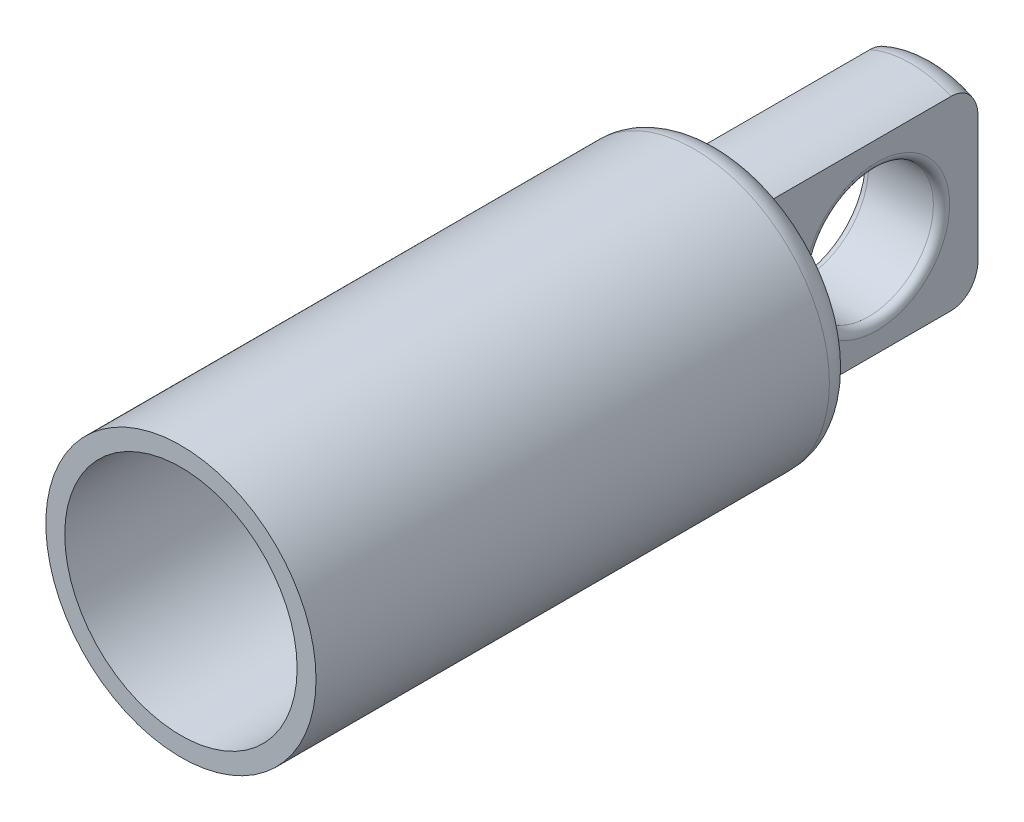
ISO-10303-21;
HEADER;
FILE_DESCRIPTION(('STEP AP214'),'2;1');
FILE_NAME('part.step','',(''),(''),'','','');
FILE_SCHEMA(('AUTOMOTIVE_DESIGN { 1 0 10303 214 1 1 1 1 }'));
ENDSEC;
DATA;
#1=APPLICATION_CONTEXT('core data for automotive mechanical design processes');
#2=APPLICATION_PROTOCOL_DEFINITION('international standard','automotive_design',2000,#1);
#3=PRODUCT_CONTEXT('',#1,'mechanical');
#4=PRODUCT('Part','Part','',(#3));
#5=PRODUCT_RELATED_PRODUCT_CATEGORY('part','',(#4));
#6=PRODUCT_DEFINITION_FORMATION('','',#4);
#7=PRODUCT_DEFINITION_CONTEXT('part definition',#1,'design');
#8=PRODUCT_DEFINITION('design','',#6,#7);
#9=PRODUCT_DEFINITION_SHAPE('','',#8);
#10=(LENGTH_UNIT() NAMED_UNIT(*) SI_UNIT(.MILLI.,.METRE.));
#11=(NAMED_UNIT(*) PLANE_ANGLE_UNIT() SI_UNIT($,.RADIAN.));
#12=(NAMED_UNIT(*) SI_UNIT($,.STERADIAN.) SOLID_ANGLE_UNIT());
#13=UNCERTAINTY_MEASURE_WITH_UNIT(LENGTH_MEASURE(1.E-05),#10,'distance_accuracy_value','');
#14=(GEOMETRIC_REPRESENTATION_CONTEXT(3) GLOBAL_UNCERTAINTY_ASSIGNED_CONTEXT((#13)) GLOBAL_UNIT_ASSIGNED_CONTEXT((#10,
#11,#12)) REPRESENTATION_CONTEXT('',''));
#15=CARTESIAN_POINT('',(0.,0.,0.));
#16=DIRECTION('',(0.,0.,1.));
#17=DIRECTION('',(1.,0.,0.));
#18=AXIS2_PLACEMENT_3D('',#15,#16,#17);
#19=CARTESIAN_POINT('',(0.,0.,-10.16));
#20=DIRECTION('',(0.,0.,1.));
#21=DIRECTION('',(1.,0.,0.));
#22=AXIS2_PLACEMENT_3D('',#19,#20,#21);
#23=CYLINDRICAL_SURFACE('',#22,4.7625);
#24=DIRECTION('',(0.,0.,-1.));
#25=VECTOR('',#24,1.);
#26=CARTESIAN_POINT('',(-1.905,-4.36490334944544,9.18557734984579));
#27=LINE('',#26,#25);
#28=CARTESIAN_POINT('',(-1.905,-4.36490334944544,0.));
#29=VERTEX_POINT('',#28);
#30=CARTESIAN_POINT('',(-1.905,-4.36490334944544,-8.89));
#31=VERTEX_POINT('',#30);
#32=EDGE_CURVE('E244',#29,#31,#27,.T.);
#33=ORIENTED_EDGE('',*,*,#32,.T.);
#34=CARTESIAN_POINT('',(0.,0.,-8.89));
#35=DIRECTION('',(0.,0.,-1.));
#36=DIRECTION('',(-1.,0.,0.));
#37=AXIS2_PLACEMENT_3D('',#34,#35,#36);
#38=CIRCLE('',#37,4.7625);
#39=CARTESIAN_POINT('',(1.905,-4.36490334944544,-8.89));
#40=VERTEX_POINT('',#39);
#41=EDGE_CURVE('E77',#31,#40,#38,.F.);
#42=ORIENTED_EDGE('',*,*,#41,.T.);
#43=DIRECTION('',(0.,0.,-1.));
#44=VECTOR('',#43,1.);
#45=CARTESIAN_POINT('',(1.905,-4.36490334944544,9.18557734984579));
#46=LINE('',#45,#44);
#47=CARTESIAN_POINT('',(1.905,-4.36490334944544,0.));
#48=VERTEX_POINT('',#47);
#49=EDGE_CURVE('E113',#48,#40,#46,.T.);
#50=ORIENTED_EDGE('',*,*,#49,.F.);
#51=CARTESIAN_POINT('',(0.,0.,0.));
#52=DIRECTION('',(0.,0.,1.));
#53=DIRECTION('',(1.,0.,0.));
#54=AXIS2_PLACEMENT_3D('',#51,#52,#53);
#55=CIRCLE('',#54,4.7625);
#56=EDGE_CURVE('E123',#48,#29,#55,.F.);
#57=ORIENTED_EDGE('',*,*,#56,.T.);
#58=EDGE_LOOP('',(#33,#42,#50,#57));
#59=FACE_BOUND('',#58,.T.);
#60=ADVANCED_FACE('F52',(#59),#23,.T.);
#61=CARTESIAN_POINT('',(0.,0.,25.4));
#62=DIRECTION('',(0.,0.,-1.));
#63=DIRECTION('',(-1.,0.,0.));
#64=AXIS2_PLACEMENT_3D('',#61,#62,#63);
#65=CYLINDRICAL_SURFACE('',#64,6.35);
#66=CARTESIAN_POINT('',(0.,0.,1.27));
#67=DIRECTION('',(0.,0.,1.));
#68=DIRECTION('',(1.,0.,0.));
#69=AXIS2_PLACEMENT_3D('',#66,#67,#68);
#70=CIRCLE('',#69,6.35);
#71=CARTESIAN_POINT('',(6.35,0.,1.27));
#72=VERTEX_POINT('',#71);
#73=EDGE_CURVE('E138',#72,#72,#70,.T.);
#74=ORIENTED_EDGE('',*,*,#73,.T.);
#75=EDGE_LOOP('',(#74));
#76=FACE_BOUND('',#75,.T.);
#77=CARTESIAN_POINT('',(0.,0.,25.4));
#78=DIRECTION('',(0.,0.,1.));
#79=DIRECTION('',(1.,0.,0.));
#80=AXIS2_PLACEMENT_3D('',#77,#78,#79);
#81=CIRCLE('',#80,6.35);
#82=CARTESIAN_POINT('',(6.35,0.,25.4));
#83=VERTEX_POINT('',#82);
#84=EDGE_CURVE('E273',#83,#83,#81,.T.);
#85=ORIENTED_EDGE('',*,*,#84,.F.);
#86=EDGE_LOOP('',(#85));
#87=FACE_BOUND('',#86,.T.);
#88=ADVANCED_FACE('F206',(#76,#87),#65,.T.);
#89=CARTESIAN_POINT('',(0.,0.,25.4));
#90=DIRECTION('',(0.,0.,1.));
#91=DIRECTION('',(1.,0.,0.));
#92=AXIS2_PLACEMENT_3D('',#89,#90,#91);
#93=PLANE('',#92);
#94=CARTESIAN_POINT('',(0.,0.,25.4));
#95=DIRECTION('',(0.,0.,1.));
#96=DIRECTION('',(1.,0.,0.));
#97=AXIS2_PLACEMENT_3D('',#94,#95,#96);
#98=CIRCLE('',#97,5.461);
#99=CARTESIAN_POINT('',(5.461,0.,25.4));
#100=VERTEX_POINT('',#99);
#101=EDGE_CURVE('E269',#100,#100,#98,.T.);
#102=ORIENTED_EDGE('',*,*,#101,.F.);
#103=EDGE_LOOP('',(#102));
#104=FACE_BOUND('',#103,.T.);
#105=ORIENTED_EDGE('',*,*,#84,.T.);
#106=EDGE_LOOP('',(#105));
#107=FACE_BOUND('',#106,.T.);
#108=ADVANCED_FACE('F203',(#104,#107),#93,.T.);
#109=CARTESIAN_POINT('',(0.,0.,0.));
#110=DIRECTION('',(0.,0.,1.));
#111=DIRECTION('',(1.,0.,0.));
#112=AXIS2_PLACEMENT_3D('',#109,#110,#111);
#113=PLANE('',#112);
#114=ORIENTED_EDGE('',*,*,#56,.F.);
#115=DIRECTION('',(0.,1.,0.));
#116=VECTOR('',#115,1.);
#117=CARTESIAN_POINT('',(1.905,4.36490334944544,0.));
#118=LINE('',#117,#116);
#119=CARTESIAN_POINT('',(1.905,4.36490334944544,0.));
#120=VERTEX_POINT('',#119);
#121=EDGE_CURVE('E108',#48,#120,#118,.T.);
#122=ORIENTED_EDGE('',*,*,#121,.T.);
#123=CARTESIAN_POINT('',(-1.905,4.36490334944544,0.));
#124=VERTEX_POINT('',#123);
#125=EDGE_CURVE('E121',#124,#120,#55,.F.);
#126=ORIENTED_EDGE('',*,*,#125,.F.);
#127=DIRECTION('',(0.,-1.,0.));
#128=VECTOR('',#127,1.);
#129=CARTESIAN_POINT('',(-1.905,4.36490334944544,0.));
#130=LINE('',#129,#128);
#131=EDGE_CURVE('E249',#124,#29,#130,.T.);
#132=ORIENTED_EDGE('',*,*,#131,.T.);
#133=EDGE_LOOP('',(#114,#122,#126,#132));
#134=FACE_BOUND('',#133,.T.);
#135=CARTESIAN_POINT('',(0.,0.,0.));
#136=DIRECTION('',(0.,0.,1.));
#137=DIRECTION('',(1.,0.,0.));
#138=AXIS2_PLACEMENT_3D('',#135,#136,#137);
#139=CIRCLE('',#138,5.08);
#140=CARTESIAN_POINT('',(5.08,0.,0.));
#141=VERTEX_POINT('',#140);
#142=EDGE_CURVE('E132',#141,#141,#139,.F.);
#143=ORIENTED_EDGE('',*,*,#142,.T.);
#144=EDGE_LOOP('',(#143));
#145=FACE_BOUND('',#144,.T.);
#146=ADVANCED_FACE('F118',(#134,#145),#113,.F.);
#147=CARTESIAN_POINT('',(0.,0.,25.4));
#148=DIRECTION('',(0.,0.,-1.));
#149=DIRECTION('',(-1.,0.,0.));
#150=AXIS2_PLACEMENT_3D('',#147,#148,#149);
#151=CYLINDRICAL_SURFACE('',#150,5.461);
#152=ORIENTED_EDGE('',*,*,#101,.T.);
#153=EDGE_LOOP('',(#152));
#154=FACE_BOUND('',#153,.T.);
#155=CARTESIAN_POINT('',(0.,0.,0.889000000000001));
#156=DIRECTION('',(0.,0.,1.));
#157=DIRECTION('',(1.,0.,0.));
#158=AXIS2_PLACEMENT_3D('',#155,#156,#157);
#159=CIRCLE('',#158,5.461);
#160=CARTESIAN_POINT('',(5.461,0.,0.889000000000001));
#161=VERTEX_POINT('',#160);
#162=EDGE_CURVE('E261',#161,#161,#159,.T.);
#163=ORIENTED_EDGE('',*,*,#162,.F.);
#164=EDGE_LOOP('',(#163));
#165=FACE_BOUND('',#164,.T.);
#166=ADVANCED_FACE('F195',(#154,#165),#151,.F.);
#167=CARTESIAN_POINT('',(0.,0.,0.889));
#168=DIRECTION('',(0.,0.,1.));
#169=DIRECTION('',(1.,0.,0.));
#170=AXIS2_PLACEMENT_3D('',#167,#168,#169);
#171=PLANE('',#170);
#172=ORIENTED_EDGE('',*,*,#162,.T.);
#173=EDGE_LOOP('',(#172));
#174=FACE_BOUND('',#173,.T.);
#175=ADVANCED_FACE('F198',(#174),#171,.T.);
#176=CARTESIAN_POINT('',(0.,0.,1.27));
#177=DIRECTION('',(0.,0.,1.));
#178=DIRECTION('',(1.,0.,0.));
#179=AXIS2_PLACEMENT_3D('',#176,#177,#178);
#180=TOROIDAL_SURFACE('',#179,5.08,1.27);
#181=ORIENTED_EDGE('',*,*,#142,.F.);
#182=EDGE_LOOP('',(#181));
#183=FACE_BOUND('',#182,.T.);
#184=ORIENTED_EDGE('',*,*,#73,.F.);
#185=EDGE_LOOP('',(#184));
#186=FACE_BOUND('',#185,.T.);
#187=ADVANCED_FACE('F194',(#183,#186),#180,.T.);
#188=DIRECTION('',(0.,0.,-1.));
#189=VECTOR('',#188,1.);
#190=CARTESIAN_POINT('',(1.905,4.36490334944544,9.18557734984579));
#191=LINE('',#190,#189);
#192=CARTESIAN_POINT('',(1.905,4.36490334944544,-8.89));
#193=VERTEX_POINT('',#192);
#194=EDGE_CURVE('E105',#120,#193,#191,.T.);
#195=ORIENTED_EDGE('',*,*,#194,.T.);
#196=CARTESIAN_POINT('',(0.,0.,-8.89));
#197=DIRECTION('',(0.,0.,-1.));
#198=DIRECTION('',(-1.,0.,0.));
#199=AXIS2_PLACEMENT_3D('',#196,#197,#198);
#200=CIRCLE('',#199,4.7625);
#201=CARTESIAN_POINT('',(-1.905,4.36490334944544,-8.89));
#202=VERTEX_POINT('',#201);
#203=EDGE_CURVE('E11',#193,#202,#200,.F.);
#204=ORIENTED_EDGE('',*,*,#203,.T.);
#205=DIRECTION('',(0.,0.,-1.));
#206=VECTOR('',#205,1.);
#207=CARTESIAN_POINT('',(-1.905,4.36490334944544,9.18557734984579));
#208=LINE('',#207,#206);
#209=EDGE_CURVE('E130',#124,#202,#208,.T.);
#210=ORIENTED_EDGE('',*,*,#209,.F.);
#211=ORIENTED_EDGE('',*,*,#125,.T.);
#212=EDGE_LOOP('',(#195,#204,#210,#211));
#213=FACE_BOUND('',#212,.T.);
#214=ADVANCED_FACE('F128',(#213),#23,.T.);
#215=CARTESIAN_POINT('',(0.,0.,-10.16));
#216=DIRECTION('',(0.,0.,-1.));
#217=DIRECTION('',(-1.,0.,0.));
#218=AXIS2_PLACEMENT_3D('',#215,#216,#217);
#219=PLANE('',#218);
#220=DIRECTION('',(0.,1.,0.));
#221=VECTOR('',#220,1.);
#222=CARTESIAN_POINT('',(1.905,4.36490334944544,-10.16));
#223=LINE('',#222,#221);
#224=CARTESIAN_POINT('',(1.905,-2.92720536519049,-10.16));
#225=VERTEX_POINT('',#224);
#226=CARTESIAN_POINT('',(1.905,2.92720536519049,-10.16));
#227=VERTEX_POINT('',#226);
#228=EDGE_CURVE('E125',#225,#227,#223,.T.);
#229=ORIENTED_EDGE('',*,*,#228,.F.);
#230=CARTESIAN_POINT('',(0.,0.,-10.16));
#231=DIRECTION('',(0.,0.,-1.));
#232=DIRECTION('',(-1.,0.,0.));
#233=AXIS2_PLACEMENT_3D('',#230,#231,#232);
#234=CIRCLE('',#233,3.4925);
#235=CARTESIAN_POINT('',(-1.905,-2.92720536519049,-10.16));
#236=VERTEX_POINT('',#235);
#237=EDGE_CURVE('E161',#225,#236,#234,.T.);
#238=ORIENTED_EDGE('',*,*,#237,.T.);
#239=DIRECTION('',(0.,-1.,0.));
#240=VECTOR('',#239,1.);
#241=CARTESIAN_POINT('',(-1.905,4.36490334944544,-10.16));
#242=LINE('',#241,#240);
#243=CARTESIAN_POINT('',(-1.905,2.92720536519049,-10.16));
#244=VERTEX_POINT('',#243);
#245=EDGE_CURVE('E246',#244,#236,#242,.T.);
#246=ORIENTED_EDGE('',*,*,#245,.F.);
#247=CARTESIAN_POINT('',(0.,0.,-10.16));
#248=DIRECTION('',(0.,0.,-1.));
#249=DIRECTION('',(-1.,0.,0.));
#250=AXIS2_PLACEMENT_3D('',#247,#248,#249);
#251=CIRCLE('',#250,3.4925);
#252=EDGE_CURVE('E157',#244,#227,#251,.T.);
#253=ORIENTED_EDGE('',*,*,#252,.T.);
#254=EDGE_LOOP('',(#229,#238,#246,#253));
#255=FACE_BOUND('',#254,.T.);
#256=ADVANCED_FACE('F184',(#255),#219,.T.);
#257=CARTESIAN_POINT('',(-1.905,4.36490334944544,9.18557734984579));
#258=DIRECTION('',(1.,0.,0.));
#259=DIRECTION('',(0.,0.,-1.));
#260=AXIS2_PLACEMENT_3D('',#257,#258,#259);
#261=PLANE('',#260);
#262=CARTESIAN_POINT('',(-1.905,0.,-5.3975));
#263=DIRECTION('',(1.,0.,0.));
#264=DIRECTION('',(0.,0.,-1.));
#265=AXIS2_PLACEMENT_3D('',#262,#263,#264);
#266=CIRCLE('',#265,3.429);
#267=CARTESIAN_POINT('',(-1.905,0.,-8.8265));
#268=VERTEX_POINT('',#267);
#269=EDGE_CURVE('E136',#268,#268,#266,.T.);
#270=ORIENTED_EDGE('',*,*,#269,.T.);
#271=EDGE_LOOP('',(#270));
#272=FACE_BOUND('',#271,.T.);
#273=ORIENTED_EDGE('',*,*,#245,.T.);
#274=CARTESIAN_POINT('',(-1.905,-2.92720536519049,-10.16));
#275=CARTESIAN_POINT('',(-1.905,-2.98132402105541,-10.1600064832095));
#276=CARTESIAN_POINT('',(-1.905,-3.03546640915894,-10.1575694277126));
#277=CARTESIAN_POINT('',(-1.905,-3.14337038378051,-10.147600787364));
#278=CARTESIAN_POINT('',(-1.905,-3.19713115345611,-10.1400604319878));
#279=CARTESIAN_POINT('',(-1.905,-3.30381074626772,-10.1196462465851));
#280=CARTESIAN_POINT('',(-1.905,-3.35672661587625,-10.1067567396132));
#281=CARTESIAN_POINT('',(-1.905,-3.46087340765745,-10.0755358837916));
#282=CARTESIAN_POINT('',(-1.905,-3.51210576523154,-10.0572093118652));
#283=CARTESIAN_POINT('',(-1.905,-3.63377839124686,-10.0059866506064));
#284=CARTESIAN_POINT('',(-1.905,-3.70303952694985,-9.97021263677757));
#285=CARTESIAN_POINT('',(-1.905,-3.83451020752514,-9.88771868456725));
#286=CARTESIAN_POINT('',(-1.905,-3.89673567753279,-9.84102423131769));
#287=CARTESIAN_POINT('',(-1.905,-4.01235640306473,-9.73713293052762));
#288=CARTESIAN_POINT('',(-1.905,-4.06570386564284,-9.67988252894815));
#289=CARTESIAN_POINT('',(-1.905,-4.16092021285018,-9.55641047586642));
#290=CARTESIAN_POINT('',(-1.905,-4.20278291350322,-9.49018401976242));
#291=CARTESIAN_POINT('',(-1.905,-4.26985685386264,-9.35715368823077));
#292=CARTESIAN_POINT('',(-1.905,-4.29622038509427,-9.29092834996992));
#293=CARTESIAN_POINT('',(-1.905,-4.33658892991174,-9.15489125363754));
#294=CARTESIAN_POINT('',(-1.905,-4.35062151379467,-9.0850878676247));
#295=CARTESIAN_POINT('',(-1.905,-4.36043965484168,-8.99397786798046));
#296=CARTESIAN_POINT('',(-1.905,-4.36211401183235,-8.9732011982541));
#297=CARTESIAN_POINT('',(-1.905,-4.36434422473604,-8.93161949765128));
#298=CARTESIAN_POINT('',(-1.905,-4.36490177407431,-8.91081455765388));
#299=CARTESIAN_POINT('',(-1.905,-4.36490334944546,-8.89));
#300=B_SPLINE_CURVE_WITH_KNOTS('',3,(#274,#275,#276,#277,#278,#279,#280,#281,#282,#283,#284,
#285,#286,#287,#288,#289,#290,#291,#292,#293,#294,#295,#296,#297,#298,#299),.UNSPECIFIED.,.F.,
.F.,(4,2,2,2,2,2,2,2,2,2,2,2,4),(0.,0.162335826820369,0.324951354612323,0.488046869242432,
0.650999512834123,0.883796058421268,1.11605465223082,1.34952572611191,1.58312226697818,
1.79588027556207,2.00816136727746,2.07067322340408,2.13309022028259),.UNSPECIFIED.);
#301=EDGE_CURVE('E173',#236,#31,#300,.T.);
#302=ORIENTED_EDGE('',*,*,#301,.T.);
#303=ORIENTED_EDGE('',*,*,#32,.F.);
#304=ORIENTED_EDGE('',*,*,#131,.F.);
#305=ORIENTED_EDGE('',*,*,#209,.T.);
#306=CARTESIAN_POINT('',(-1.905,4.36490334944544,-8.89));
#307=CARTESIAN_POINT('',(-1.905,4.36490422359483,-8.92339919910838));
#308=CARTESIAN_POINT('',(-1.905,4.36346480508041,-8.95678177763766));
#309=CARTESIAN_POINT('',(-1.905,4.35772999076058,-9.02329490045136));
#310=CARTESIAN_POINT('',(-1.905,4.35343509534946,-9.05642548786607));
#311=CARTESIAN_POINT('',(-1.905,4.33634337546593,-9.15489806950019));
#312=CARTESIAN_POINT('',(-1.905,4.31933911241619,-9.21955802636618));
#313=CARTESIAN_POINT('',(-1.905,4.27475667885088,-9.34506168882081));
#314=CARTESIAN_POINT('',(-1.905,4.24717995463365,-9.40590591507211));
#315=CARTESIAN_POINT('',(-1.905,4.1824556513036,-9.52228788782987));
#316=CARTESIAN_POINT('',(-1.905,4.14530451663395,-9.57782365245797));
#317=CARTESIAN_POINT('',(-1.905,4.06158354676759,-9.6837275420454));
#318=CARTESIAN_POINT('',(-1.905,4.01478585752914,-9.73391495783361));
#319=CARTESIAN_POINT('',(-1.905,3.91397899782167,-9.8263799471498));
#320=CARTESIAN_POINT('',(-1.905,3.85996996730528,-9.8686576741452));
#321=CARTESIAN_POINT('',(-1.905,3.74194657661533,-9.94764916451322));
#322=CARTESIAN_POINT('',(-1.905,3.6774828837546,-9.98368986955687));
#323=CARTESIAN_POINT('',(-1.905,3.54380992591659,-10.0457069429606));
#324=CARTESIAN_POINT('',(-1.905,3.47459377568293,-10.0716683304353));
#325=CARTESIAN_POINT('',(-1.905,3.32657767116101,-10.1155078617819));
#326=CARTESIAN_POINT('',(-1.905,3.2474882057244,-10.1323976470139));
#327=CARTESIAN_POINT('',(-1.905,3.08795205769954,-10.1546476910731));
#328=CARTESIAN_POINT('',(-1.905,3.0075107274282,-10.1600458876112));
#329=CARTESIAN_POINT('',(-1.905,2.92720536519049,-10.16));
#330=B_SPLINE_CURVE_WITH_KNOTS('',3,(#306,#307,#308,#309,#310,#311,#312,#313,#314,#315,#316,
#317,#318,#319,#320,#321,#322,#323,#324,#325,#326,#327,#328,#329),.UNSPECIFIED.,.F.,.F.,(4,2,2,
2,2,2,2,2,2,2,2,4),(0.,0.100133888262806,0.200250233668484,0.399780863197951,0.599284206941912,
0.798861745352971,1.00384490895569,1.20882409496814,1.42948410837142,1.65047084446328,
1.89221565367468,2.13316113395296),.UNSPECIFIED.);
#331=EDGE_CURVE('E165',#202,#244,#330,.T.);
#332=ORIENTED_EDGE('',*,*,#331,.T.);
#333=EDGE_LOOP('',(#273,#302,#303,#304,#305,#332));
#334=FACE_BOUND('',#333,.T.);
#335=ADVANCED_FACE('F179',(#272,#334),#261,.F.);
#336=CARTESIAN_POINT('',(1.905,4.36490334944544,9.18557734984579));
#337=DIRECTION('',(-1.,0.,0.));
#338=DIRECTION('',(0.,0.,1.));
#339=AXIS2_PLACEMENT_3D('',#336,#337,#338);
#340=PLANE('',#339);
#341=CARTESIAN_POINT('',(1.905,0.,-5.3975));
#342=DIRECTION('',(-1.,0.,0.));
#343=DIRECTION('',(0.,0.,1.));
#344=AXIS2_PLACEMENT_3D('',#341,#342,#343);
#345=CIRCLE('',#344,3.429);
#346=CARTESIAN_POINT('',(1.905,0.,-1.9685));
#347=VERTEX_POINT('',#346);
#348=EDGE_CURVE('E153',#347,#347,#345,.T.);
#349=ORIENTED_EDGE('',*,*,#348,.T.);
#350=EDGE_LOOP('',(#349));
#351=FACE_BOUND('',#350,.T.);
#352=ORIENTED_EDGE('',*,*,#49,.T.);
#353=CARTESIAN_POINT('',(1.905,-4.36490334944544,-8.89));
#354=CARTESIAN_POINT('',(1.905,-4.36490422359483,-8.92339919910838));
#355=CARTESIAN_POINT('',(1.905,-4.36346480508041,-8.95678177763765));
#356=CARTESIAN_POINT('',(1.905,-4.35772999076058,-9.02329490045136));
#357=CARTESIAN_POINT('',(1.905,-4.35343509534946,-9.05642548786607));
#358=CARTESIAN_POINT('',(1.905,-4.33634337546593,-9.15489806950019));
#359=CARTESIAN_POINT('',(1.905,-4.31933911241619,-9.21955802636618));
#360=CARTESIAN_POINT('',(1.905,-4.27475667885088,-9.34506168882081));
#361=CARTESIAN_POINT('',(1.905,-4.24717995463365,-9.40590591507211));
#362=CARTESIAN_POINT('',(1.905,-4.1824556513036,-9.52228788782987));
#363=CARTESIAN_POINT('',(1.905,-4.14530451663396,-9.57782365245797));
#364=CARTESIAN_POINT('',(1.905,-4.06158354676759,-9.6837275420454));
#365=CARTESIAN_POINT('',(1.905,-4.01478585752914,-9.73391495783361));
#366=CARTESIAN_POINT('',(1.905,-3.91397899782168,-9.8263799471498));
#367=CARTESIAN_POINT('',(1.905,-3.85996996730528,-9.8686576741452));
#368=CARTESIAN_POINT('',(1.905,-3.74194657661533,-9.94764916451322));
#369=CARTESIAN_POINT('',(1.905,-3.6774828837546,-9.98368986955687));
#370=CARTESIAN_POINT('',(1.905,-3.54380992591659,-10.0457069429606));
#371=CARTESIAN_POINT('',(1.905,-3.47459377568293,-10.0716683304353));
#372=CARTESIAN_POINT('',(1.905,-3.32657767116101,-10.1155078617819));
#373=CARTESIAN_POINT('',(1.905,-3.2474882057244,-10.1323976470139));
#374=CARTESIAN_POINT('',(1.905,-3.08795205769954,-10.1546476910731));
#375=CARTESIAN_POINT('',(1.905,-3.0075107274282,-10.1600458876112));
#376=CARTESIAN_POINT('',(1.905,-2.92720536519049,-10.16));
#377=B_SPLINE_CURVE_WITH_KNOTS('',3,(#353,#354,#355,#356,#357,#358,#359,#360,#361,#362,#363,
#364,#365,#366,#367,#368,#369,#370,#371,#372,#373,#374,#375,#376),.UNSPECIFIED.,.F.,.F.,(4,2,2,
2,2,2,2,2,2,2,2,4),(0.,0.100133888262804,0.20025023366848,0.399780863197951,0.599284206941913,
0.798861745352971,1.00384490895569,1.20882409496814,1.42948410837142,1.65047084446328,
1.89221565367468,2.13316113395296),.UNSPECIFIED.);
#378=EDGE_CURVE('E62',#40,#225,#377,.T.);
#379=ORIENTED_EDGE('',*,*,#378,.T.);
#380=ORIENTED_EDGE('',*,*,#228,.T.);
#381=CARTESIAN_POINT('',(1.905,2.92720536519049,-10.16));
#382=CARTESIAN_POINT('',(1.905,2.98132402105542,-10.1600064832095));
#383=CARTESIAN_POINT('',(1.905,3.03546640915895,-10.1575694277126));
#384=CARTESIAN_POINT('',(1.905,3.14337038378051,-10.147600787364));
#385=CARTESIAN_POINT('',(1.905,3.19713115345611,-10.1400604319878));
#386=CARTESIAN_POINT('',(1.905,3.30381074626772,-10.1196462465851));
#387=CARTESIAN_POINT('',(1.905,3.35672661587625,-10.1067567396132));
#388=CARTESIAN_POINT('',(1.905,3.46087340765745,-10.0755358837916));
#389=CARTESIAN_POINT('',(1.905,3.51210576523154,-10.0572093118652));
#390=CARTESIAN_POINT('',(1.905,3.63377839124686,-10.0059866506064));
#391=CARTESIAN_POINT('',(1.905,3.70303952694985,-9.97021263677757));
#392=CARTESIAN_POINT('',(1.905,3.83451020752514,-9.88771868456725));
#393=CARTESIAN_POINT('',(1.905,3.89673567753279,-9.84102423131769));
#394=CARTESIAN_POINT('',(1.905,4.01235640306473,-9.73713293052761));
#395=CARTESIAN_POINT('',(1.905,4.06570386564284,-9.67988252894815));
#396=CARTESIAN_POINT('',(1.905,4.16092021285018,-9.55641047586642));
#397=CARTESIAN_POINT('',(1.905,4.20278291350322,-9.49018401976242));
#398=CARTESIAN_POINT('',(1.905,4.26985685386264,-9.35715368823077));
#399=CARTESIAN_POINT('',(1.905,4.29622038509428,-9.29092834996992));
#400=CARTESIAN_POINT('',(1.905,4.33658892991174,-9.15489125363753));
#401=CARTESIAN_POINT('',(1.905,4.35062151379468,-9.0850878676247));
#402=CARTESIAN_POINT('',(1.905,4.36043965484168,-8.99397786798046));
#403=CARTESIAN_POINT('',(1.905,4.36211401183235,-8.9732011982541));
#404=CARTESIAN_POINT('',(1.905,4.36434422473604,-8.93161949765128));
#405=CARTESIAN_POINT('',(1.905,4.36490177407431,-8.91081455765388));
#406=CARTESIAN_POINT('',(1.905,4.36490334944546,-8.89));
#407=B_SPLINE_CURVE_WITH_KNOTS('',3,(#381,#382,#383,#384,#385,#386,#387,#388,#389,#390,#391,
#392,#393,#394,#395,#396,#397,#398,#399,#400,#401,#402,#403,#404,#405,#406),.UNSPECIFIED.,.F.,
.F.,(4,2,2,2,2,2,2,2,2,2,2,2,4),(0.,0.16233582682037,0.324951354612324,0.488046869242433,
0.650999512834123,0.883796058421267,1.11605465223083,1.34952572611191,1.58312226697818,
1.79588027556207,2.00816136727746,2.07067322340408,2.13309022028259),.UNSPECIFIED.);
#408=EDGE_CURVE('E69',#227,#193,#407,.T.);
#409=ORIENTED_EDGE('',*,*,#408,.T.);
#410=ORIENTED_EDGE('',*,*,#194,.F.);
#411=ORIENTED_EDGE('',*,*,#121,.F.);
#412=EDGE_LOOP('',(#352,#379,#380,#409,#410,#411));
#413=FACE_BOUND('',#412,.T.);
#414=ADVANCED_FACE('F107',(#351,#413),#340,.F.);
#415=CARTESIAN_POINT('',(-6.35,0.,-5.3975));
#416=DIRECTION('',(1.,0.,0.));
#417=DIRECTION('',(0.,0.,-1.));
#418=AXIS2_PLACEMENT_3D('',#415,#416,#417);
#419=CYLINDRICAL_SURFACE('',#418,3.048);
#420=CARTESIAN_POINT('',(-1.524,0.,-5.3975));
#421=DIRECTION('',(1.,0.,0.));
#422=DIRECTION('',(0.,0.,-1.));
#423=AXIS2_PLACEMENT_3D('',#420,#421,#422);
#424=CIRCLE('',#423,3.048);
#425=CARTESIAN_POINT('',(-1.524,0.,-8.4455));
#426=VERTEX_POINT('',#425);
#427=EDGE_CURVE('E149',#426,#426,#424,.F.);
#428=ORIENTED_EDGE('',*,*,#427,.T.);
#429=EDGE_LOOP('',(#428));
#430=FACE_BOUND('',#429,.T.);
#431=CARTESIAN_POINT('',(1.524,0.,-5.3975));
#432=DIRECTION('',(-1.,0.,0.));
#433=DIRECTION('',(0.,0.,1.));
#434=AXIS2_PLACEMENT_3D('',#431,#432,#433);
#435=CIRCLE('',#434,3.048);
#436=CARTESIAN_POINT('',(1.524,0.,-2.3495));
#437=VERTEX_POINT('',#436);
#438=EDGE_CURVE('E145',#437,#437,#435,.F.);
#439=ORIENTED_EDGE('',*,*,#438,.T.);
#440=EDGE_LOOP('',(#439));
#441=FACE_BOUND('',#440,.T.);
#442=ADVANCED_FACE('F220',(#430,#441),#419,.F.);
#443=CARTESIAN_POINT('',(-1.524,0.,-5.3975));
#444=DIRECTION('',(1.,0.,0.));
#445=DIRECTION('',(0.,0.,-1.));
#446=AXIS2_PLACEMENT_3D('',#443,#444,#445);
#447=TOROIDAL_SURFACE('',#446,3.429,0.381);
#448=ORIENTED_EDGE('',*,*,#427,.F.);
#449=EDGE_LOOP('',(#448));
#450=FACE_BOUND('',#449,.T.);
#451=ORIENTED_EDGE('',*,*,#269,.F.);
#452=EDGE_LOOP('',(#451));
#453=FACE_BOUND('',#452,.T.);
#454=ADVANCED_FACE('F216',(#450,#453),#447,.T.);
#455=CARTESIAN_POINT('',(1.524,0.,-5.3975));
#456=DIRECTION('',(-1.,0.,0.));
#457=DIRECTION('',(0.,0.,1.));
#458=AXIS2_PLACEMENT_3D('',#455,#456,#457);
#459=TOROIDAL_SURFACE('',#458,3.429,0.381);
#460=ORIENTED_EDGE('',*,*,#348,.F.);
#461=EDGE_LOOP('',(#460));
#462=FACE_BOUND('',#461,.T.);
#463=ORIENTED_EDGE('',*,*,#438,.F.);
#464=EDGE_LOOP('',(#463));
#465=FACE_BOUND('',#464,.T.);
#466=ADVANCED_FACE('F219',(#462,#465),#459,.T.);
#467=CARTESIAN_POINT('',(0.,0.,-8.89));
#468=DIRECTION('',(0.,0.,-1.));
#469=DIRECTION('',(-1.,0.,0.));
#470=AXIS2_PLACEMENT_3D('',#467,#468,#469);
#471=TOROIDAL_SURFACE('',#470,3.4925,1.27);
#472=ORIENTED_EDGE('',*,*,#378,.F.);
#473=ORIENTED_EDGE('',*,*,#41,.F.);
#474=ORIENTED_EDGE('',*,*,#301,.F.);
#475=ORIENTED_EDGE('',*,*,#237,.F.);
#476=EDGE_LOOP('',(#472,#473,#474,#475));
#477=FACE_BOUND('',#476,.T.);
#478=ADVANCED_FACE('F223',(#477),#471,.T.);
#479=CARTESIAN_POINT('',(0.,0.,-8.89));
#480=DIRECTION('',(0.,0.,-1.));
#481=DIRECTION('',(-1.,0.,0.));
#482=AXIS2_PLACEMENT_3D('',#479,#480,#481);
#483=TOROIDAL_SURFACE('',#482,3.4925,1.27);
#484=ORIENTED_EDGE('',*,*,#331,.F.);
#485=ORIENTED_EDGE('',*,*,#203,.F.);
#486=ORIENTED_EDGE('',*,*,#408,.F.);
#487=ORIENTED_EDGE('',*,*,#252,.F.);
#488=EDGE_LOOP('',(#484,#485,#486,#487));
#489=FACE_BOUND('',#488,.T.);
#490=ADVANCED_FACE('F54',(#489),#483,.T.);
#491=CLOSED_SHELL('',(#60,#88,#108,#146,#166,#175,#187,#214,#256,#335,#414,#442,#454,#466,#478,#490));
#492=MANIFOLD_SOLID_BREP('B2',#491);
#493=ADVANCED_BREP_SHAPE_REPRESENTATION('',(#18,#492),#14);
#494=SHAPE_DEFINITION_REPRESENTATION(#9,#493);
ENDSEC;
END-ISO-10303-21;
